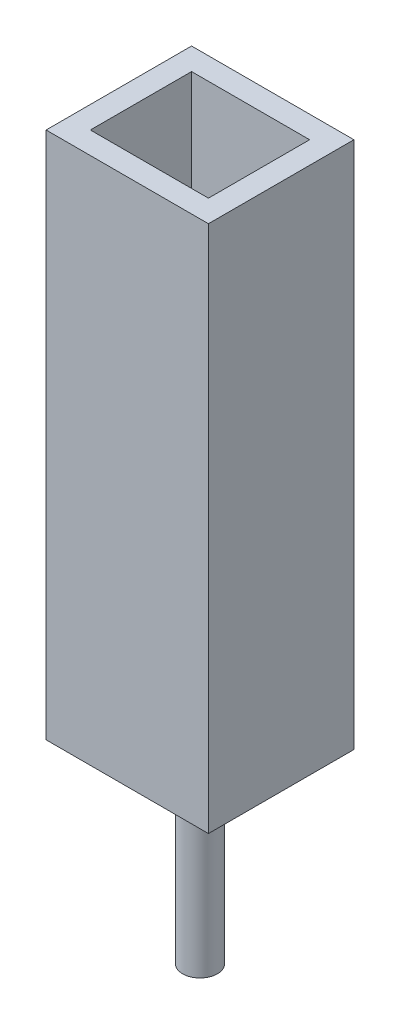
ISO-10303-21;
HEADER;
FILE_DESCRIPTION(('STEP AP214'),'2;1');
FILE_NAME('part.step','',(''),(''),'','','');
FILE_SCHEMA(('AUTOMOTIVE_DESIGN { 1 0 10303 214 1 1 1 1 }'));
ENDSEC;
DATA;
#1=APPLICATION_CONTEXT('core data for automotive mechanical design processes');
#2=APPLICATION_PROTOCOL_DEFINITION('international standard','automotive_design',2000,#1);
#3=PRODUCT_CONTEXT('',#1,'mechanical');
#4=PRODUCT('Part','Part','',(#3));
#5=PRODUCT_RELATED_PRODUCT_CATEGORY('part','',(#4));
#6=PRODUCT_DEFINITION_FORMATION('','',#4);
#7=PRODUCT_DEFINITION_CONTEXT('part definition',#1,'design');
#8=PRODUCT_DEFINITION('design','',#6,#7);
#9=PRODUCT_DEFINITION_SHAPE('','',#8);
#10=(LENGTH_UNIT() NAMED_UNIT(*) SI_UNIT(.MILLI.,.METRE.));
#11=(NAMED_UNIT(*) PLANE_ANGLE_UNIT() SI_UNIT($,.RADIAN.));
#12=(NAMED_UNIT(*) SI_UNIT($,.STERADIAN.) SOLID_ANGLE_UNIT());
#13=UNCERTAINTY_MEASURE_WITH_UNIT(LENGTH_MEASURE(1.E-05),#10,'distance_accuracy_value','');
#14=(GEOMETRIC_REPRESENTATION_CONTEXT(3) GLOBAL_UNCERTAINTY_ASSIGNED_CONTEXT((#13)) GLOBAL_UNIT_ASSIGNED_CONTEXT((#10,
#11,#12)) REPRESENTATION_CONTEXT('',''));
#15=CARTESIAN_POINT('',(0.,0.,0.));
#16=DIRECTION('',(0.,0.,1.));
#17=DIRECTION('',(1.,0.,0.));
#18=AXIS2_PLACEMENT_3D('',#15,#16,#17);
#19=CARTESIAN_POINT('',(0.,0.35,0.));
#20=DIRECTION('',(0.,-1.,0.));
#21=DIRECTION('',(0.,0.,-1.));
#22=AXIS2_PLACEMENT_3D('',#19,#20,#21);
#23=PLANE('',#22);
#24=DIRECTION('',(1.,0.,0.));
#25=VECTOR('',#24,1.);
#26=CARTESIAN_POINT('',(-1.283333333333,0.35,-0.8));
#27=LINE('',#26,#25);
#28=CARTESIAN_POINT('',(-0.933333333333,0.35,-0.8));
#29=VERTEX_POINT('',#28);
#30=CARTESIAN_POINT('',(0.933333333333,0.35,-0.8));
#31=VERTEX_POINT('',#30);
#32=EDGE_CURVE('E85',#29,#31,#27,.T.);
#33=ORIENTED_EDGE('',*,*,#32,.F.);
#34=DIRECTION('',(0.,0.,-1.));
#35=VECTOR('',#34,1.);
#36=CARTESIAN_POINT('',(-0.933333333333,0.35,1.15));
#37=LINE('',#36,#35);
#38=CARTESIAN_POINT('',(-0.933333333333,0.35,0.8));
#39=VERTEX_POINT('',#38);
#40=EDGE_CURVE('E79',#39,#29,#37,.T.);
#41=ORIENTED_EDGE('',*,*,#40,.F.);
#42=DIRECTION('',(-1.,0.,0.));
#43=VECTOR('',#42,1.);
#44=CARTESIAN_POINT('',(-1.283333333333,0.35,0.8));
#45=LINE('',#44,#43);
#46=CARTESIAN_POINT('',(0.933333333333,0.35,0.8));
#47=VERTEX_POINT('',#46);
#48=EDGE_CURVE('E98',#47,#39,#45,.T.);
#49=ORIENTED_EDGE('',*,*,#48,.F.);
#50=DIRECTION('',(0.,0.,1.));
#51=VECTOR('',#50,1.);
#52=CARTESIAN_POINT('',(0.933333333333,0.35,1.15));
#53=LINE('',#52,#51);
#54=EDGE_CURVE('E97',#31,#47,#53,.T.);
#55=ORIENTED_EDGE('',*,*,#54,.F.);
#56=EDGE_LOOP('',(#33,#41,#49,#55));
#57=FACE_BOUND('',#56,.T.);
#58=ADVANCED_FACE('F17',(#57),#23,.F.);
#59=CARTESIAN_POINT('',(-0.933333333333,8.35,1.15));
#60=DIRECTION('',(1.,0.,0.));
#61=DIRECTION('',(0.,0.,-1.));
#62=AXIS2_PLACEMENT_3D('',#59,#60,#61);
#63=PLANE('',#62);
#64=DIRECTION('',(0.,0.,-1.));
#65=VECTOR('',#64,1.);
#66=CARTESIAN_POINT('',(-0.933333333333,8.35,1.15));
#67=LINE('',#66,#65);
#68=CARTESIAN_POINT('',(-0.933333333333,8.35,-0.8));
#69=VERTEX_POINT('',#68);
#70=CARTESIAN_POINT('',(-0.933333333333,8.35,0.8));
#71=VERTEX_POINT('',#70);
#72=EDGE_CURVE('E102',#69,#71,#67,.F.);
#73=ORIENTED_EDGE('',*,*,#72,.T.);
#74=DIRECTION('',(0.,1.,0.));
#75=VECTOR('',#74,1.);
#76=CARTESIAN_POINT('',(-0.933333333333,8.35,0.8));
#77=LINE('',#76,#75);
#78=EDGE_CURVE('E145',#39,#71,#77,.T.);
#79=ORIENTED_EDGE('',*,*,#78,.F.);
#80=ORIENTED_EDGE('',*,*,#40,.T.);
#81=DIRECTION('',(0.,1.,0.));
#82=VECTOR('',#81,1.);
#83=CARTESIAN_POINT('',(-0.933333333333,8.35,-0.8));
#84=LINE('',#83,#82);
#85=EDGE_CURVE('E92',#69,#29,#84,.F.);
#86=ORIENTED_EDGE('',*,*,#85,.F.);
#87=EDGE_LOOP('',(#73,#79,#80,#86));
#88=FACE_BOUND('',#87,.T.);
#89=ADVANCED_FACE('F150',(#88),#63,.T.);
#90=CARTESIAN_POINT('',(0.933333333333,8.35,1.15));
#91=DIRECTION('',(-1.,0.,0.));
#92=DIRECTION('',(0.,0.,1.));
#93=AXIS2_PLACEMENT_3D('',#90,#91,#92);
#94=PLANE('',#93);
#95=DIRECTION('',(0.,0.,1.));
#96=VECTOR('',#95,1.);
#97=CARTESIAN_POINT('',(0.933333333333,8.35,1.15));
#98=LINE('',#97,#96);
#99=CARTESIAN_POINT('',(0.933333333333,8.35,0.8));
#100=VERTEX_POINT('',#99);
#101=CARTESIAN_POINT('',(0.933333333333,8.35,-0.8));
#102=VERTEX_POINT('',#101);
#103=EDGE_CURVE('E94',#100,#102,#98,.F.);
#104=ORIENTED_EDGE('',*,*,#103,.T.);
#105=DIRECTION('',(0.,1.,0.));
#106=VECTOR('',#105,1.);
#107=CARTESIAN_POINT('',(0.933333333333,8.35,-0.8));
#108=LINE('',#107,#106);
#109=EDGE_CURVE('E90',#31,#102,#108,.T.);
#110=ORIENTED_EDGE('',*,*,#109,.F.);
#111=ORIENTED_EDGE('',*,*,#54,.T.);
#112=DIRECTION('',(0.,1.,0.));
#113=VECTOR('',#112,1.);
#114=CARTESIAN_POINT('',(0.933333333333,8.35,0.8));
#115=LINE('',#114,#113);
#116=EDGE_CURVE('E143',#100,#47,#115,.F.);
#117=ORIENTED_EDGE('',*,*,#116,.F.);
#118=EDGE_LOOP('',(#104,#110,#111,#117));
#119=FACE_BOUND('',#118,.T.);
#120=ADVANCED_FACE('F104',(#119),#94,.T.);
#121=CARTESIAN_POINT('',(0.,-3.,0.));
#122=DIRECTION('',(0.,-1.,0.));
#123=DIRECTION('',(0.,0.,-1.));
#124=AXIS2_PLACEMENT_3D('',#121,#122,#123);
#125=PLANE('',#124);
#126=CARTESIAN_POINT('',(0.,-3.,0.));
#127=DIRECTION('',(0.,1.,0.));
#128=DIRECTION('',(0.,0.,1.));
#129=AXIS2_PLACEMENT_3D('',#126,#127,#128);
#130=CIRCLE('',#129,0.275);
#131=CARTESIAN_POINT('',(0.,-3.,0.275));
#132=VERTEX_POINT('',#131);
#133=EDGE_CURVE('E20',#132,#132,#130,.T.);
#134=ORIENTED_EDGE('',*,*,#133,.F.);
#135=EDGE_LOOP('',(#134));
#136=FACE_BOUND('',#135,.T.);
#137=ADVANCED_FACE('F251',(#136),#125,.T.);
#138=CARTESIAN_POINT('',(-1.283333333333,8.35,-0.8));
#139=DIRECTION('',(0.,0.,1.));
#140=DIRECTION('',(1.,0.,0.));
#141=AXIS2_PLACEMENT_3D('',#138,#139,#140);
#142=PLANE('',#141);
#143=DIRECTION('',(1.,0.,0.));
#144=VECTOR('',#143,1.);
#145=CARTESIAN_POINT('',(0.,8.35,-0.8));
#146=LINE('',#145,#144);
#147=EDGE_CURVE('E133',#102,#69,#146,.F.);
#148=ORIENTED_EDGE('',*,*,#147,.T.);
#149=ORIENTED_EDGE('',*,*,#85,.T.);
#150=ORIENTED_EDGE('',*,*,#32,.T.);
#151=ORIENTED_EDGE('',*,*,#109,.T.);
#152=EDGE_LOOP('',(#148,#149,#150,#151));
#153=FACE_BOUND('',#152,.T.);
#154=ADVANCED_FACE('F88',(#153),#142,.T.);
#155=CARTESIAN_POINT('',(-1.283333333333,8.35,0.8));
#156=DIRECTION('',(0.,0.,-1.));
#157=DIRECTION('',(-1.,0.,0.));
#158=AXIS2_PLACEMENT_3D('',#155,#156,#157);
#159=PLANE('',#158);
#160=DIRECTION('',(1.,0.,0.));
#161=VECTOR('',#160,1.);
#162=CARTESIAN_POINT('',(0.,8.35,0.8));
#163=LINE('',#162,#161);
#164=EDGE_CURVE('E127',#71,#100,#163,.T.);
#165=ORIENTED_EDGE('',*,*,#164,.T.);
#166=ORIENTED_EDGE('',*,*,#116,.T.);
#167=ORIENTED_EDGE('',*,*,#48,.T.);
#168=ORIENTED_EDGE('',*,*,#78,.T.);
#169=EDGE_LOOP('',(#165,#166,#167,#168));
#170=FACE_BOUND('',#169,.T.);
#171=ADVANCED_FACE('F148',(#170),#159,.T.);
#172=CARTESIAN_POINT('',(0.,-3.,0.));
#173=DIRECTION('',(0.,1.,0.));
#174=DIRECTION('',(0.,0.,1.));
#175=AXIS2_PLACEMENT_3D('',#172,#173,#174);
#176=CYLINDRICAL_SURFACE('',#175,0.275);
#177=CARTESIAN_POINT('',(0.,0.,0.));
#178=DIRECTION('',(0.,1.,0.));
#179=DIRECTION('',(0.,0.,1.));
#180=AXIS2_PLACEMENT_3D('',#177,#178,#179);
#181=CIRCLE('',#180,0.275);
#182=CARTESIAN_POINT('',(0.,0.,0.275));
#183=VERTEX_POINT('',#182);
#184=EDGE_CURVE('E111',#183,#183,#181,.T.);
#185=ORIENTED_EDGE('',*,*,#184,.F.);
#186=EDGE_LOOP('',(#185));
#187=FACE_BOUND('',#186,.T.);
#188=ORIENTED_EDGE('',*,*,#133,.T.);
#189=EDGE_LOOP('',(#188));
#190=FACE_BOUND('',#189,.T.);
#191=ADVANCED_FACE('F223',(#187,#190),#176,.T.);
#192=CARTESIAN_POINT('',(-1.283333333333,8.35,1.15));
#193=DIRECTION('',(0.,0.,-1.));
#194=DIRECTION('',(-1.,0.,0.));
#195=AXIS2_PLACEMENT_3D('',#192,#193,#194);
#196=PLANE('',#195);
#197=DIRECTION('',(0.,1.,0.));
#198=VECTOR('',#197,1.);
#199=CARTESIAN_POINT('',(1.283333333333,8.35,1.15));
#200=LINE('',#199,#198);
#201=CARTESIAN_POINT('',(1.283333333333,0.,1.15));
#202=VERTEX_POINT('',#201);
#203=CARTESIAN_POINT('',(1.283333333333,8.35,1.15));
#204=VERTEX_POINT('',#203);
#205=EDGE_CURVE('E140',#202,#204,#200,.T.);
#206=ORIENTED_EDGE('',*,*,#205,.T.);
#207=DIRECTION('',(1.,0.,0.));
#208=VECTOR('',#207,1.);
#209=CARTESIAN_POINT('',(0.,8.35,1.15));
#210=LINE('',#209,#208);
#211=CARTESIAN_POINT('',(-1.283333333333,8.35,1.15));
#212=VERTEX_POINT('',#211);
#213=EDGE_CURVE('E138',#204,#212,#210,.F.);
#214=ORIENTED_EDGE('',*,*,#213,.T.);
#215=DIRECTION('',(0.,1.,0.));
#216=VECTOR('',#215,1.);
#217=CARTESIAN_POINT('',(-1.283333333333,8.35,1.15));
#218=LINE('',#217,#216);
#219=CARTESIAN_POINT('',(-1.283333333333,0.,1.15));
#220=VERTEX_POINT('',#219);
#221=EDGE_CURVE('E114',#212,#220,#218,.F.);
#222=ORIENTED_EDGE('',*,*,#221,.T.);
#223=DIRECTION('',(1.,0.,0.));
#224=VECTOR('',#223,1.);
#225=CARTESIAN_POINT('',(0.,0.,1.15));
#226=LINE('',#225,#224);
#227=EDGE_CURVE('E118',#202,#220,#226,.F.);
#228=ORIENTED_EDGE('',*,*,#227,.F.);
#229=EDGE_LOOP('',(#206,#214,#222,#228));
#230=FACE_BOUND('',#229,.T.);
#231=ADVANCED_FACE('F172',(#230),#196,.F.);
#232=CARTESIAN_POINT('',(1.283333333333,8.35,1.15));
#233=DIRECTION('',(-1.,0.,0.));
#234=DIRECTION('',(0.,0.,1.));
#235=AXIS2_PLACEMENT_3D('',#232,#233,#234);
#236=PLANE('',#235);
#237=DIRECTION('',(0.,1.,0.));
#238=VECTOR('',#237,1.);
#239=CARTESIAN_POINT('',(1.283333333333,8.35,-1.15));
#240=LINE('',#239,#238);
#241=CARTESIAN_POINT('',(1.283333333333,0.,-1.15));
#242=VERTEX_POINT('',#241);
#243=CARTESIAN_POINT('',(1.283333333333,8.35,-1.15));
#244=VERTEX_POINT('',#243);
#245=EDGE_CURVE('E164',#242,#244,#240,.T.);
#246=ORIENTED_EDGE('',*,*,#245,.T.);
#247=DIRECTION('',(0.,0.,-1.));
#248=VECTOR('',#247,1.);
#249=CARTESIAN_POINT('',(1.283333333333,8.35,0.));
#250=LINE('',#249,#248);
#251=EDGE_CURVE('E135',#244,#204,#250,.F.);
#252=ORIENTED_EDGE('',*,*,#251,.T.);
#253=ORIENTED_EDGE('',*,*,#205,.F.);
#254=DIRECTION('',(0.,0.,-1.));
#255=VECTOR('',#254,1.);
#256=CARTESIAN_POINT('',(1.283333333333,0.,0.));
#257=LINE('',#256,#255);
#258=EDGE_CURVE('E113',#242,#202,#257,.F.);
#259=ORIENTED_EDGE('',*,*,#258,.F.);
#260=EDGE_LOOP('',(#246,#252,#253,#259));
#261=FACE_BOUND('',#260,.T.);
#262=ADVANCED_FACE('F156',(#261),#236,.F.);
#263=CARTESIAN_POINT('',(0.,8.35,0.));
#264=DIRECTION('',(0.,-1.,0.));
#265=DIRECTION('',(0.,0.,-1.));
#266=AXIS2_PLACEMENT_3D('',#263,#264,#265);
#267=PLANE('',#266);
#268=ORIENTED_EDGE('',*,*,#164,.F.);
#269=ORIENTED_EDGE('',*,*,#72,.F.);
#270=ORIENTED_EDGE('',*,*,#147,.F.);
#271=ORIENTED_EDGE('',*,*,#103,.F.);
#272=EDGE_LOOP('',(#268,#269,#270,#271));
#273=FACE_BOUND('',#272,.T.);
#274=DIRECTION('',(1.,0.,0.));
#275=VECTOR('',#274,1.);
#276=CARTESIAN_POINT('',(-1.283333333333,8.35,-1.15));
#277=LINE('',#276,#275);
#278=CARTESIAN_POINT('',(-1.283333333333,8.35,-1.15));
#279=VERTEX_POINT('',#278);
#280=EDGE_CURVE('E160',#244,#279,#277,.F.);
#281=ORIENTED_EDGE('',*,*,#280,.T.);
#282=DIRECTION('',(0.,0.,-1.));
#283=VECTOR('',#282,1.);
#284=CARTESIAN_POINT('',(-1.283333333333,8.35,1.15));
#285=LINE('',#284,#283);
#286=EDGE_CURVE('E121',#279,#212,#285,.F.);
#287=ORIENTED_EDGE('',*,*,#286,.T.);
#288=ORIENTED_EDGE('',*,*,#213,.F.);
#289=ORIENTED_EDGE('',*,*,#251,.F.);
#290=EDGE_LOOP('',(#281,#287,#288,#289));
#291=FACE_BOUND('',#290,.T.);
#292=ADVANCED_FACE('F152',(#273,#291),#267,.F.);
#293=CARTESIAN_POINT('',(-1.283333333333,8.35,1.15));
#294=DIRECTION('',(1.,0.,0.));
#295=DIRECTION('',(0.,0.,-1.));
#296=AXIS2_PLACEMENT_3D('',#293,#294,#295);
#297=PLANE('',#296);
#298=ORIENTED_EDGE('',*,*,#221,.F.);
#299=ORIENTED_EDGE('',*,*,#286,.F.);
#300=DIRECTION('',(0.,1.,0.));
#301=VECTOR('',#300,1.);
#302=CARTESIAN_POINT('',(-1.283333333333,8.35,-1.15));
#303=LINE('',#302,#301);
#304=CARTESIAN_POINT('',(-1.283333333333,0.,-1.15));
#305=VERTEX_POINT('',#304);
#306=EDGE_CURVE('E26',#279,#305,#303,.F.);
#307=ORIENTED_EDGE('',*,*,#306,.T.);
#308=DIRECTION('',(0.,0.,-1.));
#309=VECTOR('',#308,1.);
#310=CARTESIAN_POINT('',(-1.283333333333,0.,0.));
#311=LINE('',#310,#309);
#312=EDGE_CURVE('E34',#220,#305,#311,.T.);
#313=ORIENTED_EDGE('',*,*,#312,.F.);
#314=EDGE_LOOP('',(#298,#299,#307,#313));
#315=FACE_BOUND('',#314,.T.);
#316=ADVANCED_FACE('F155',(#315),#297,.F.);
#317=CARTESIAN_POINT('',(0.,0.,0.));
#318=DIRECTION('',(0.,-1.,0.));
#319=DIRECTION('',(0.,0.,-1.));
#320=AXIS2_PLACEMENT_3D('',#317,#318,#319);
#321=PLANE('',#320);
#322=ORIENTED_EDGE('',*,*,#312,.T.);
#323=DIRECTION('',(1.,0.,0.));
#324=VECTOR('',#323,1.);
#325=CARTESIAN_POINT('',(-1.283333333333,0.,-1.15));
#326=LINE('',#325,#324);
#327=EDGE_CURVE('E11',#305,#242,#326,.T.);
#328=ORIENTED_EDGE('',*,*,#327,.T.);
#329=ORIENTED_EDGE('',*,*,#258,.T.);
#330=ORIENTED_EDGE('',*,*,#227,.T.);
#331=EDGE_LOOP('',(#322,#328,#329,#330));
#332=FACE_BOUND('',#331,.T.);
#333=ORIENTED_EDGE('',*,*,#184,.T.);
#334=EDGE_LOOP('',(#333));
#335=FACE_BOUND('',#334,.T.);
#336=ADVANCED_FACE('F170',(#332,#335),#321,.T.);
#337=CARTESIAN_POINT('',(-1.283333333333,8.35,-1.15));
#338=DIRECTION('',(0.,0.,1.));
#339=DIRECTION('',(1.,0.,0.));
#340=AXIS2_PLACEMENT_3D('',#337,#338,#339);
#341=PLANE('',#340);
#342=ORIENTED_EDGE('',*,*,#306,.F.);
#343=ORIENTED_EDGE('',*,*,#280,.F.);
#344=ORIENTED_EDGE('',*,*,#245,.F.);
#345=ORIENTED_EDGE('',*,*,#327,.F.);
#346=EDGE_LOOP('',(#342,#343,#344,#345));
#347=FACE_BOUND('',#346,.T.);
#348=ADVANCED_FACE('F174',(#347),#341,.F.);
#349=CLOSED_SHELL('',(#58,#89,#120,#137,#154,#171,#191,#231,#262,#292,#316,#336,#348));
#350=MANIFOLD_SOLID_BREP('B1',#349);
#351=ADVANCED_BREP_SHAPE_REPRESENTATION('',(#18,#350),#14);
#352=SHAPE_DEFINITION_REPRESENTATION(#9,#351);
ENDSEC;
END-ISO-10303-21;
